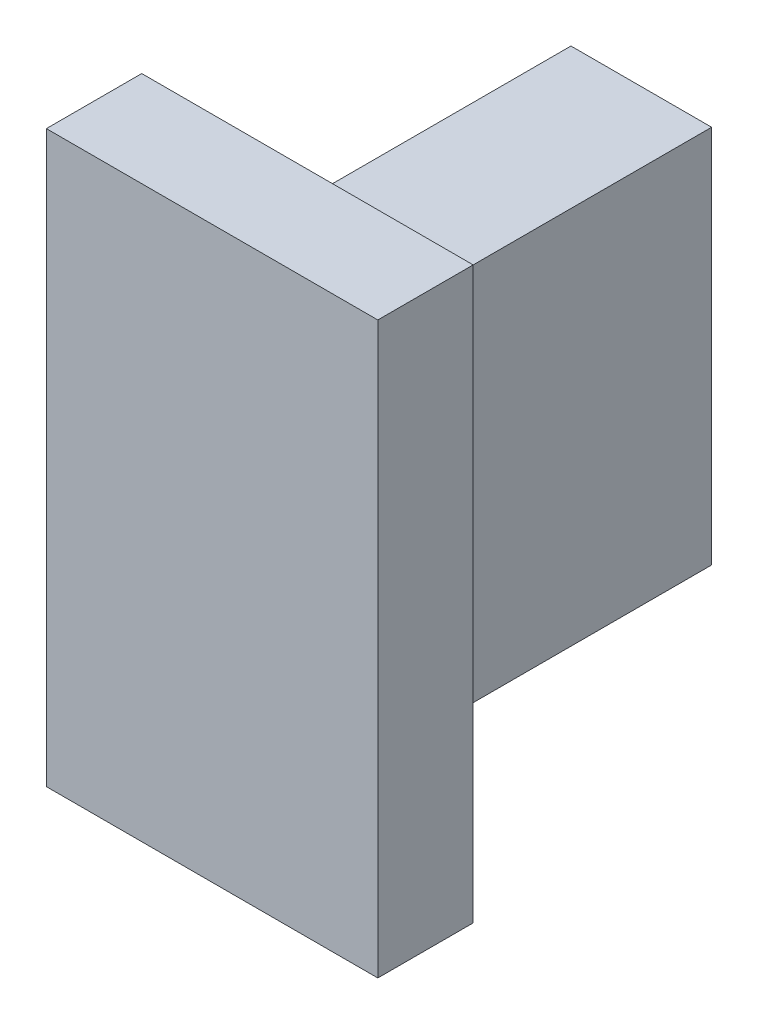
ISO-10303-21;
HEADER;
FILE_DESCRIPTION(('STEP AP214'),'2;1');
FILE_NAME('part.step','',(''),(''),'','','');
FILE_SCHEMA(('AUTOMOTIVE_DESIGN { 1 0 10303 214 1 1 1 1 }'));
ENDSEC;
DATA;
#1=APPLICATION_CONTEXT('core data for automotive mechanical design processes');
#2=APPLICATION_PROTOCOL_DEFINITION('international standard','automotive_design',2000,#1);
#3=PRODUCT_CONTEXT('',#1,'mechanical');
#4=PRODUCT('Part','Part','',(#3));
#5=PRODUCT_RELATED_PRODUCT_CATEGORY('part','',(#4));
#6=PRODUCT_DEFINITION_FORMATION('','',#4);
#7=PRODUCT_DEFINITION_CONTEXT('part definition',#1,'design');
#8=PRODUCT_DEFINITION('design','',#6,#7);
#9=PRODUCT_DEFINITION_SHAPE('','',#8);
#10=(LENGTH_UNIT() NAMED_UNIT(*) SI_UNIT(.MILLI.,.METRE.));
#11=(NAMED_UNIT(*) PLANE_ANGLE_UNIT() SI_UNIT($,.RADIAN.));
#12=(NAMED_UNIT(*) SI_UNIT($,.STERADIAN.) SOLID_ANGLE_UNIT());
#13=UNCERTAINTY_MEASURE_WITH_UNIT(LENGTH_MEASURE(1.E-05),#10,'distance_accuracy_value','');
#14=(GEOMETRIC_REPRESENTATION_CONTEXT(3) GLOBAL_UNCERTAINTY_ASSIGNED_CONTEXT((#13)) GLOBAL_UNIT_ASSIGNED_CONTEXT((#10,
#11,#12)) REPRESENTATION_CONTEXT('',''));
#15=CARTESIAN_POINT('',(0.,0.,0.));
#16=DIRECTION('',(0.,0.,1.));
#17=DIRECTION('',(1.,0.,0.));
#18=AXIS2_PLACEMENT_3D('',#15,#16,#17);
#19=CARTESIAN_POINT('',(-0.531620553359684,1.23320158102767,8.));
#20=DIRECTION('',(1.,0.,0.));
#21=DIRECTION('',(0.,1.,0.));
#22=AXIS2_PLACEMENT_3D('',#19,#20,#21);
#23=PLANE('',#22);
#24=DIRECTION('',(0.,-1.,0.));
#25=VECTOR('',#24,1.);
#26=CARTESIAN_POINT('',(-0.531620553359684,1.23320158102767,7.5));
#27=LINE('',#26,#25);
#28=CARTESIAN_POINT('',(-0.531620553359684,-2.74429841897233,7.5));
#29=VERTEX_POINT('',#28);
#30=CARTESIAN_POINT('',(-0.531620553359684,-4.18429841897233,7.5));
#31=VERTEX_POINT('',#30);
#32=EDGE_CURVE('E568',#29,#31,#27,.T.);
#33=ORIENTED_EDGE('',*,*,#32,.T.);
#34=DIRECTION('',(0.,0.,1.));
#35=VECTOR('',#34,1.);
#36=CARTESIAN_POINT('',(-0.531620553359684,-4.18429841897233,-1.97294196569489));
#37=LINE('',#36,#35);
#38=CARTESIAN_POINT('',(-0.531620553359684,-4.18429841897233,0.));
#39=VERTEX_POINT('',#38);
#40=EDGE_CURVE('E326',#39,#31,#37,.T.);
#41=ORIENTED_EDGE('',*,*,#40,.F.);
#42=DIRECTION('',(0.,-1.,0.));
#43=VECTOR('',#42,1.);
#44=CARTESIAN_POINT('',(-0.531620553359684,1.23320158102767,0.));
#45=LINE('',#44,#43);
#46=CARTESIAN_POINT('',(-0.531620553359684,-2.74429841897233,0.));
#47=VERTEX_POINT('',#46);
#48=EDGE_CURVE('E587',#47,#39,#45,.T.);
#49=ORIENTED_EDGE('',*,*,#48,.F.);
#50=DIRECTION('',(0.,0.,1.));
#51=VECTOR('',#50,1.);
#52=CARTESIAN_POINT('',(-0.531620553359684,-2.74429841897233,-1.97294196569489));
#53=LINE('',#52,#51);
#54=EDGE_CURVE('E354',#47,#29,#53,.T.);
#55=ORIENTED_EDGE('',*,*,#54,.T.);
#56=EDGE_LOOP('',(#33,#41,#49,#55));
#57=FACE_BOUND('',#56,.T.);
#58=ADVANCED_FACE('F39',(#57),#23,.T.);
#59=CARTESIAN_POINT('',(-0.531620553359684,-4.48429841897233,0.));
#60=VERTEX_POINT('',#59);
#61=CARTESIAN_POINT('',(-0.531620553359683,-6.21679841897233,0.));
#62=VERTEX_POINT('',#61);
#63=EDGE_CURVE('E407',#60,#62,#45,.T.);
#64=ORIENTED_EDGE('',*,*,#63,.F.);
#65=DIRECTION('',(0.,0.,1.));
#66=VECTOR('',#65,1.);
#67=CARTESIAN_POINT('',(-0.531620553359684,-4.48429841897233,-1.97294196569489));
#68=LINE('',#67,#66);
#69=CARTESIAN_POINT('',(-0.531620553359684,-4.48429841897233,7.5));
#70=VERTEX_POINT('',#69);
#71=EDGE_CURVE('E329',#60,#70,#68,.T.);
#72=ORIENTED_EDGE('',*,*,#71,.T.);
#73=CARTESIAN_POINT('',(-0.531620553359683,-6.21679841897233,7.5));
#74=VERTEX_POINT('',#73);
#75=EDGE_CURVE('E420',#70,#74,#27,.T.);
#76=ORIENTED_EDGE('',*,*,#75,.T.);
#77=DIRECTION('',(0.,0.,-1.));
#78=VECTOR('',#77,1.);
#79=CARTESIAN_POINT('',(-0.531620553359683,-6.21679841897233,8.));
#80=LINE('',#79,#78);
#81=EDGE_CURVE('E408',#74,#62,#80,.T.);
#82=ORIENTED_EDGE('',*,*,#81,.T.);
#83=EDGE_LOOP('',(#64,#72,#76,#82));
#84=FACE_BOUND('',#83,.T.);
#85=ADVANCED_FACE('F524',(#84),#23,.T.);
#86=CARTESIAN_POINT('',(1.41837944664032,1.23320158102767,8.));
#87=DIRECTION('',(-1.,0.,0.));
#88=DIRECTION('',(0.,-1.,0.));
#89=AXIS2_PLACEMENT_3D('',#86,#87,#88);
#90=PLANE('',#89);
#91=DIRECTION('',(0.,1.,0.));
#92=VECTOR('',#91,1.);
#93=CARTESIAN_POINT('',(1.41837944664032,1.23320158102767,0.));
#94=LINE('',#93,#92);
#95=CARTESIAN_POINT('',(1.41837944664032,-4.18429841897233,0.));
#96=VERTEX_POINT('',#95);
#97=CARTESIAN_POINT('',(1.41837944664032,-2.74429841897233,0.));
#98=VERTEX_POINT('',#97);
#99=EDGE_CURVE('E456',#96,#98,#94,.T.);
#100=ORIENTED_EDGE('',*,*,#99,.F.);
#101=DIRECTION('',(0.,0.,1.));
#102=VECTOR('',#101,1.);
#103=CARTESIAN_POINT('',(1.41837944664032,-4.18429841897233,-1.97294196569489));
#104=LINE('',#103,#102);
#105=CARTESIAN_POINT('',(1.41837944664032,-4.18429841897233,7.5));
#106=VERTEX_POINT('',#105);
#107=EDGE_CURVE('E55',#96,#106,#104,.T.);
#108=ORIENTED_EDGE('',*,*,#107,.T.);
#109=DIRECTION('',(0.,1.,0.));
#110=VECTOR('',#109,1.);
#111=CARTESIAN_POINT('',(1.41837944664032,1.23320158102767,7.5));
#112=LINE('',#111,#110);
#113=CARTESIAN_POINT('',(1.41837944664032,-2.74429841897233,7.5));
#114=VERTEX_POINT('',#113);
#115=EDGE_CURVE('E439',#106,#114,#112,.T.);
#116=ORIENTED_EDGE('',*,*,#115,.T.);
#117=DIRECTION('',(0.,0.,1.));
#118=VECTOR('',#117,1.);
#119=CARTESIAN_POINT('',(1.41837944664032,-2.74429841897233,-1.97294196569489));
#120=LINE('',#119,#118);
#121=EDGE_CURVE('E358',#98,#114,#120,.T.);
#122=ORIENTED_EDGE('',*,*,#121,.F.);
#123=EDGE_LOOP('',(#100,#108,#116,#122));
#124=FACE_BOUND('',#123,.T.);
#125=ADVANCED_FACE('F531',(#124),#90,.T.);
#126=CARTESIAN_POINT('',(1.41837944664032,-6.21679841897233,7.5));
#127=VERTEX_POINT('',#126);
#128=CARTESIAN_POINT('',(1.41837944664032,-4.48429841897233,7.5));
#129=VERTEX_POINT('',#128);
#130=EDGE_CURVE('E435',#127,#129,#112,.T.);
#131=ORIENTED_EDGE('',*,*,#130,.T.);
#132=DIRECTION('',(0.,0.,1.));
#133=VECTOR('',#132,1.);
#134=CARTESIAN_POINT('',(1.41837944664032,-4.48429841897233,-1.97294196569489));
#135=LINE('',#134,#133);
#136=CARTESIAN_POINT('',(1.41837944664032,-4.48429841897233,0.));
#137=VERTEX_POINT('',#136);
#138=EDGE_CURVE('E333',#137,#129,#135,.T.);
#139=ORIENTED_EDGE('',*,*,#138,.F.);
#140=CARTESIAN_POINT('',(1.41837944664032,-6.21679841897233,0.));
#141=VERTEX_POINT('',#140);
#142=EDGE_CURVE('E452',#141,#137,#94,.T.);
#143=ORIENTED_EDGE('',*,*,#142,.F.);
#144=DIRECTION('',(0.,0.,-1.));
#145=VECTOR('',#144,1.);
#146=CARTESIAN_POINT('',(1.41837944664032,-6.21679841897233,8.));
#147=LINE('',#146,#145);
#148=EDGE_CURVE('E413',#127,#141,#147,.T.);
#149=ORIENTED_EDGE('',*,*,#148,.F.);
#150=EDGE_LOOP('',(#131,#139,#143,#149));
#151=FACE_BOUND('',#150,.T.);
#152=ADVANCED_FACE('F558',(#151),#90,.T.);
#153=CARTESIAN_POINT('',(0.,0.,7.5));
#154=DIRECTION('',(0.,0.,1.));
#155=DIRECTION('',(1.,0.,0.));
#156=AXIS2_PLACEMENT_3D('',#153,#154,#155);
#157=PLANE('',#156);
#158=DIRECTION('',(1.,0.,0.));
#159=VECTOR('',#158,1.);
#160=CARTESIAN_POINT('',(1.41837944664032,-4.18429841897233,7.5));
#161=LINE('',#160,#159);
#162=EDGE_CURVE('E321',#31,#106,#161,.T.);
#163=ORIENTED_EDGE('',*,*,#162,.F.);
#164=ORIENTED_EDGE('',*,*,#32,.F.);
#165=DIRECTION('',(-1.,0.,0.));
#166=VECTOR('',#165,1.);
#167=CARTESIAN_POINT('',(1.41837944664032,-2.74429841897233,7.5));
#168=LINE('',#167,#166);
#169=EDGE_CURVE('E317',#114,#29,#168,.T.);
#170=ORIENTED_EDGE('',*,*,#169,.F.);
#171=ORIENTED_EDGE('',*,*,#115,.F.);
#172=EDGE_LOOP('',(#163,#164,#170,#171));
#173=FACE_BOUND('',#172,.T.);
#174=ADVANCED_FACE('F559',(#173),#157,.F.);
#175=DIRECTION('',(-1.,0.,0.));
#176=VECTOR('',#175,1.);
#177=CARTESIAN_POINT('',(1.41837944664032,-4.48429841897233,7.5));
#178=LINE('',#177,#176);
#179=EDGE_CURVE('E305',#129,#70,#178,.T.);
#180=ORIENTED_EDGE('',*,*,#179,.F.);
#181=ORIENTED_EDGE('',*,*,#130,.F.);
#182=DIRECTION('',(1.,0.,0.));
#183=VECTOR('',#182,1.);
#184=CARTESIAN_POINT('',(-1.03162055335968,-6.21679841897233,7.5));
#185=LINE('',#184,#183);
#186=EDGE_CURVE('E418',#74,#127,#185,.T.);
#187=ORIENTED_EDGE('',*,*,#186,.F.);
#188=ORIENTED_EDGE('',*,*,#75,.F.);
#189=EDGE_LOOP('',(#180,#181,#187,#188));
#190=FACE_BOUND('',#189,.T.);
#191=ADVANCED_FACE('F550',(#190),#157,.F.);
#192=CARTESIAN_POINT('',(-0.531620553359684,-1.00429841897233,7.5));
#193=VERTEX_POINT('',#192);
#194=CARTESIAN_POINT('',(-0.531620553359684,-2.44429841897233,7.5));
#195=VERTEX_POINT('',#194);
#196=EDGE_CURVE('E419',#193,#195,#27,.T.);
#197=ORIENTED_EDGE('',*,*,#196,.T.);
#198=DIRECTION('',(0.,0.,1.));
#199=VECTOR('',#198,1.);
#200=CARTESIAN_POINT('',(-0.531620553359684,-2.44429841897233,-1.97294196569489));
#201=LINE('',#200,#199);
#202=CARTESIAN_POINT('',(-0.531620553359684,-2.44429841897233,0.));
#203=VERTEX_POINT('',#202);
#204=EDGE_CURVE('E351',#203,#195,#201,.T.);
#205=ORIENTED_EDGE('',*,*,#204,.F.);
#206=CARTESIAN_POINT('',(-0.531620553359684,-1.00429841897233,0.));
#207=VERTEX_POINT('',#206);
#208=EDGE_CURVE('E447',#207,#203,#45,.T.);
#209=ORIENTED_EDGE('',*,*,#208,.F.);
#210=DIRECTION('',(0.,0.,1.));
#211=VECTOR('',#210,1.);
#212=CARTESIAN_POINT('',(-0.531620553359684,-1.00429841897233,-1.97294196569489));
#213=LINE('',#212,#211);
#214=EDGE_CURVE('E383',#207,#193,#213,.T.);
#215=ORIENTED_EDGE('',*,*,#214,.T.);
#216=EDGE_LOOP('',(#197,#205,#209,#215));
#217=FACE_BOUND('',#216,.T.);
#218=ADVANCED_FACE('F533',(#217),#23,.T.);
#219=CARTESIAN_POINT('',(1.41837944664032,-2.44429841897233,0.));
#220=VERTEX_POINT('',#219);
#221=CARTESIAN_POINT('',(1.41837944664032,-1.00429841897233,0.));
#222=VERTEX_POINT('',#221);
#223=EDGE_CURVE('E596',#220,#222,#94,.T.);
#224=ORIENTED_EDGE('',*,*,#223,.F.);
#225=DIRECTION('',(0.,0.,1.));
#226=VECTOR('',#225,1.);
#227=CARTESIAN_POINT('',(1.41837944664032,-2.44429841897233,-1.97294196569489));
#228=LINE('',#227,#226);
#229=CARTESIAN_POINT('',(1.41837944664032,-2.44429841897233,7.5));
#230=VERTEX_POINT('',#229);
#231=EDGE_CURVE('E63',#220,#230,#228,.T.);
#232=ORIENTED_EDGE('',*,*,#231,.T.);
#233=CARTESIAN_POINT('',(1.41837944664032,-1.00429841897233,7.5));
#234=VERTEX_POINT('',#233);
#235=EDGE_CURVE('E601',#230,#234,#112,.T.);
#236=ORIENTED_EDGE('',*,*,#235,.T.);
#237=DIRECTION('',(0.,0.,1.));
#238=VECTOR('',#237,1.);
#239=CARTESIAN_POINT('',(1.41837944664032,-1.00429841897233,-1.97294196569489));
#240=LINE('',#239,#238);
#241=EDGE_CURVE('E387',#222,#234,#240,.T.);
#242=ORIENTED_EDGE('',*,*,#241,.F.);
#243=EDGE_LOOP('',(#224,#232,#236,#242));
#244=FACE_BOUND('',#243,.T.);
#245=ADVANCED_FACE('F547',(#244),#90,.T.);
#246=DIRECTION('',(1.,0.,0.));
#247=VECTOR('',#246,1.);
#248=CARTESIAN_POINT('',(1.41837944664032,-2.44429841897233,7.5));
#249=LINE('',#248,#247);
#250=EDGE_CURVE('E346',#195,#230,#249,.T.);
#251=ORIENTED_EDGE('',*,*,#250,.F.);
#252=ORIENTED_EDGE('',*,*,#196,.F.);
#253=DIRECTION('',(-1.,0.,0.));
#254=VECTOR('',#253,1.);
#255=CARTESIAN_POINT('',(1.41837944664032,-1.00429841897233,7.5));
#256=LINE('',#255,#254);
#257=EDGE_CURVE('E342',#234,#193,#256,.T.);
#258=ORIENTED_EDGE('',*,*,#257,.F.);
#259=ORIENTED_EDGE('',*,*,#235,.F.);
#260=EDGE_LOOP('',(#251,#252,#258,#259));
#261=FACE_BOUND('',#260,.T.);
#262=ADVANCED_FACE('F539',(#261),#157,.F.);
#263=CARTESIAN_POINT('',(-0.531620553359684,0.733201581027668,7.5));
#264=VERTEX_POINT('',#263);
#265=CARTESIAN_POINT('',(-0.531620553359684,-0.704298418972332,7.5));
#266=VERTEX_POINT('',#265);
#267=EDGE_CURVE('E414',#264,#266,#27,.T.);
#268=ORIENTED_EDGE('',*,*,#267,.T.);
#269=DIRECTION('',(0.,0.,1.));
#270=VECTOR('',#269,1.);
#271=CARTESIAN_POINT('',(-0.531620553359684,-0.704298418972332,-1.97294196569489));
#272=LINE('',#271,#270);
#273=CARTESIAN_POINT('',(-0.531620553359684,-0.704298418972331,0.));
#274=VERTEX_POINT('',#273);
#275=EDGE_CURVE('E379',#274,#266,#272,.T.);
#276=ORIENTED_EDGE('',*,*,#275,.F.);
#277=CARTESIAN_POINT('',(-0.531620553359684,0.733201581027668,0.));
#278=VERTEX_POINT('',#277);
#279=EDGE_CURVE('E442',#278,#274,#45,.T.);
#280=ORIENTED_EDGE('',*,*,#279,.F.);
#281=DIRECTION('',(0.,0.,-1.));
#282=VECTOR('',#281,1.);
#283=CARTESIAN_POINT('',(-0.531620553359684,0.733201581027668,8.));
#284=LINE('',#283,#282);
#285=EDGE_CURVE('E421',#264,#278,#284,.T.);
#286=ORIENTED_EDGE('',*,*,#285,.F.);
#287=EDGE_LOOP('',(#268,#276,#280,#286));
#288=FACE_BOUND('',#287,.T.);
#289=ADVANCED_FACE('F527',(#288),#23,.T.);
#290=CARTESIAN_POINT('',(1.41837944664032,-0.704298418972331,0.));
#291=VERTEX_POINT('',#290);
#292=CARTESIAN_POINT('',(1.41837944664032,0.733201581027668,0.));
#293=VERTEX_POINT('',#292);
#294=EDGE_CURVE('E457',#291,#293,#94,.T.);
#295=ORIENTED_EDGE('',*,*,#294,.F.);
#296=DIRECTION('',(0.,0.,1.));
#297=VECTOR('',#296,1.);
#298=CARTESIAN_POINT('',(1.41837944664032,-0.704298418972332,-1.97294196569489));
#299=LINE('',#298,#297);
#300=CARTESIAN_POINT('',(1.41837944664032,-0.704298418972332,7.5));
#301=VERTEX_POINT('',#300);
#302=EDGE_CURVE('E376',#291,#301,#299,.T.);
#303=ORIENTED_EDGE('',*,*,#302,.T.);
#304=CARTESIAN_POINT('',(1.41837944664032,0.733201581027668,7.5));
#305=VERTEX_POINT('',#304);
#306=EDGE_CURVE('E431',#301,#305,#112,.T.);
#307=ORIENTED_EDGE('',*,*,#306,.T.);
#308=DIRECTION('',(0.,0.,-1.));
#309=VECTOR('',#308,1.);
#310=CARTESIAN_POINT('',(1.41837944664032,0.733201581027668,8.));
#311=LINE('',#310,#309);
#312=EDGE_CURVE('E424',#305,#293,#311,.T.);
#313=ORIENTED_EDGE('',*,*,#312,.T.);
#314=EDGE_LOOP('',(#295,#303,#307,#313));
#315=FACE_BOUND('',#314,.T.);
#316=ADVANCED_FACE('F538',(#315),#90,.T.);
#317=DIRECTION('',(1.,0.,0.));
#318=VECTOR('',#317,1.);
#319=CARTESIAN_POINT('',(1.41837944664032,-0.704298418972332,7.5));
#320=LINE('',#319,#318);
#321=EDGE_CURVE('E372',#266,#301,#320,.T.);
#322=ORIENTED_EDGE('',*,*,#321,.F.);
#323=ORIENTED_EDGE('',*,*,#267,.F.);
#324=DIRECTION('',(-1.,0.,0.));
#325=VECTOR('',#324,1.);
#326=CARTESIAN_POINT('',(-1.03162055335968,0.733201581027668,7.5));
#327=LINE('',#326,#325);
#328=EDGE_CURVE('E425',#305,#264,#327,.T.);
#329=ORIENTED_EDGE('',*,*,#328,.F.);
#330=ORIENTED_EDGE('',*,*,#306,.F.);
#331=EDGE_LOOP('',(#322,#323,#329,#330));
#332=FACE_BOUND('',#331,.T.);
#333=ADVANCED_FACE('F522',(#332),#157,.F.);
#334=CARTESIAN_POINT('',(-1.03162055335968,1.23320158102767,8.));
#335=DIRECTION('',(1.,0.,0.));
#336=DIRECTION('',(0.,1.,0.));
#337=AXIS2_PLACEMENT_3D('',#334,#335,#336);
#338=PLANE('',#337);
#339=DIRECTION('',(0.,-1.,0.));
#340=VECTOR('',#339,1.);
#341=CARTESIAN_POINT('',(-1.03162055335968,1.23320158102767,0.));
#342=LINE('',#341,#340);
#343=CARTESIAN_POINT('',(-1.03162055335968,1.23320158102767,0.));
#344=VERTEX_POINT('',#343);
#345=CARTESIAN_POINT('',(-1.03162055335968,-6.71679841897233,0.));
#346=VERTEX_POINT('',#345);
#347=EDGE_CURVE('E412',#344,#346,#342,.T.);
#348=ORIENTED_EDGE('',*,*,#347,.T.);
#349=DIRECTION('',(0.,0.,-1.));
#350=VECTOR('',#349,1.);
#351=CARTESIAN_POINT('',(-1.03162055335968,-6.71679841897233,8.));
#352=LINE('',#351,#350);
#353=CARTESIAN_POINT('',(-1.03162055335968,-6.71679841897233,8.));
#354=VERTEX_POINT('',#353);
#355=EDGE_CURVE('E11',#354,#346,#352,.T.);
#356=ORIENTED_EDGE('',*,*,#355,.F.);
#357=DIRECTION('',(0.,-1.,0.));
#358=VECTOR('',#357,1.);
#359=CARTESIAN_POINT('',(-1.03162055335968,1.23320158102767,8.));
#360=LINE('',#359,#358);
#361=CARTESIAN_POINT('',(-1.03162055335968,1.23320158102767,8.));
#362=VERTEX_POINT('',#361);
#363=EDGE_CURVE('E461',#362,#354,#360,.T.);
#364=ORIENTED_EDGE('',*,*,#363,.F.);
#365=DIRECTION('',(0.,0.,-1.));
#366=VECTOR('',#365,1.);
#367=CARTESIAN_POINT('',(-1.03162055335968,1.23320158102767,8.));
#368=LINE('',#367,#366);
#369=EDGE_CURVE('E478',#362,#344,#368,.T.);
#370=ORIENTED_EDGE('',*,*,#369,.T.);
#371=EDGE_LOOP('',(#348,#356,#364,#370));
#372=FACE_BOUND('',#371,.T.);
#373=ADVANCED_FACE('F41',(#372),#338,.F.);
#374=CARTESIAN_POINT('',(-1.03162055335968,-6.71679841897233,8.));
#375=DIRECTION('',(0.,1.,0.));
#376=DIRECTION('',(0.,0.,1.));
#377=AXIS2_PLACEMENT_3D('',#374,#375,#376);
#378=PLANE('',#377);
#379=DIRECTION('',(1.,0.,0.));
#380=VECTOR('',#379,1.);
#381=CARTESIAN_POINT('',(-1.03162055335968,-6.71679841897233,0.));
#382=LINE('',#381,#380);
#383=CARTESIAN_POINT('',(1.91837944664032,-6.71679841897233,0.));
#384=VERTEX_POINT('',#383);
#385=EDGE_CURVE('E482',#346,#384,#382,.T.);
#386=ORIENTED_EDGE('',*,*,#385,.T.);
#387=DIRECTION('',(0.,0.,-1.));
#388=VECTOR('',#387,1.);
#389=CARTESIAN_POINT('',(1.91837944664032,-6.71679841897233,8.));
#390=LINE('',#389,#388);
#391=CARTESIAN_POINT('',(1.91837944664032,-6.71679841897233,8.));
#392=VERTEX_POINT('',#391);
#393=EDGE_CURVE('E48',#392,#384,#390,.T.);
#394=ORIENTED_EDGE('',*,*,#393,.F.);
#395=DIRECTION('',(1.,0.,0.));
#396=VECTOR('',#395,1.);
#397=CARTESIAN_POINT('',(-1.03162055335968,-6.71679841897233,8.));
#398=LINE('',#397,#396);
#399=EDGE_CURVE('E465',#354,#392,#398,.T.);
#400=ORIENTED_EDGE('',*,*,#399,.F.);
#401=ORIENTED_EDGE('',*,*,#355,.T.);
#402=EDGE_LOOP('',(#386,#394,#400,#401));
#403=FACE_BOUND('',#402,.T.);
#404=ADVANCED_FACE('F515',(#403),#378,.F.);
#405=CARTESIAN_POINT('',(1.91837944664032,1.23320158102767,8.));
#406=DIRECTION('',(-1.,0.,0.));
#407=DIRECTION('',(0.,-1.,0.));
#408=AXIS2_PLACEMENT_3D('',#405,#406,#407);
#409=PLANE('',#408);
#410=DIRECTION('',(0.,1.,0.));
#411=VECTOR('',#410,1.);
#412=CARTESIAN_POINT('',(1.91837944664032,1.23320158102767,0.));
#413=LINE('',#412,#411);
#414=CARTESIAN_POINT('',(1.91837944664032,1.23320158102767,0.));
#415=VERTEX_POINT('',#414);
#416=EDGE_CURVE('E485',#384,#415,#413,.T.);
#417=ORIENTED_EDGE('',*,*,#416,.T.);
#418=DIRECTION('',(0.,0.,-1.));
#419=VECTOR('',#418,1.);
#420=CARTESIAN_POINT('',(1.91837944664032,1.23320158102767,8.));
#421=LINE('',#420,#419);
#422=CARTESIAN_POINT('',(1.91837944664032,1.23320158102767,8.));
#423=VERTEX_POINT('',#422);
#424=EDGE_CURVE('E493',#423,#415,#421,.T.);
#425=ORIENTED_EDGE('',*,*,#424,.F.);
#426=DIRECTION('',(0.,1.,0.));
#427=VECTOR('',#426,1.);
#428=CARTESIAN_POINT('',(1.91837944664032,1.23320158102767,8.));
#429=LINE('',#428,#427);
#430=EDGE_CURVE('E470',#392,#423,#429,.T.);
#431=ORIENTED_EDGE('',*,*,#430,.F.);
#432=ORIENTED_EDGE('',*,*,#393,.T.);
#433=EDGE_LOOP('',(#417,#425,#431,#432));
#434=FACE_BOUND('',#433,.T.);
#435=ADVANCED_FACE('F501',(#434),#409,.F.);
#436=CARTESIAN_POINT('',(-1.03162055335968,1.23320158102767,8.));
#437=DIRECTION('',(0.,-1.,0.));
#438=DIRECTION('',(0.,0.,-1.));
#439=AXIS2_PLACEMENT_3D('',#436,#437,#438);
#440=PLANE('',#439);
#441=DIRECTION('',(-1.,0.,0.));
#442=VECTOR('',#441,1.);
#443=CARTESIAN_POINT('',(-1.03162055335968,1.23320158102767,0.));
#444=LINE('',#443,#442);
#445=EDGE_CURVE('E466',#415,#344,#444,.T.);
#446=ORIENTED_EDGE('',*,*,#445,.T.);
#447=ORIENTED_EDGE('',*,*,#369,.F.);
#448=DIRECTION('',(-1.,0.,0.));
#449=VECTOR('',#448,1.);
#450=CARTESIAN_POINT('',(-1.03162055335968,1.23320158102767,8.));
#451=LINE('',#450,#449);
#452=EDGE_CURVE('E474',#423,#362,#451,.T.);
#453=ORIENTED_EDGE('',*,*,#452,.F.);
#454=ORIENTED_EDGE('',*,*,#424,.T.);
#455=EDGE_LOOP('',(#446,#447,#453,#454));
#456=FACE_BOUND('',#455,.T.);
#457=ADVANCED_FACE('F509',(#456),#440,.F.);
#458=CARTESIAN_POINT('',(0.,0.,0.));
#459=DIRECTION('',(0.,0.,1.));
#460=DIRECTION('',(1.,0.,0.));
#461=AXIS2_PLACEMENT_3D('',#458,#459,#460);
#462=PLANE('',#461);
#463=DIRECTION('',(1.,0.,0.));
#464=VECTOR('',#463,1.);
#465=CARTESIAN_POINT('',(1.41837944664032,-4.48429841897233,0.));
#466=LINE('',#465,#464);
#467=EDGE_CURVE('E314',#60,#137,#466,.T.);
#468=ORIENTED_EDGE('',*,*,#467,.F.);
#469=ORIENTED_EDGE('',*,*,#63,.T.);
#470=DIRECTION('',(1.,0.,0.));
#471=VECTOR('',#470,1.);
#472=CARTESIAN_POINT('',(-1.03162055335968,-6.21679841897233,0.));
#473=LINE('',#472,#471);
#474=EDGE_CURVE('E446',#62,#141,#473,.T.);
#475=ORIENTED_EDGE('',*,*,#474,.T.);
#476=ORIENTED_EDGE('',*,*,#142,.T.);
#477=EDGE_LOOP('',(#468,#469,#475,#476));
#478=FACE_BOUND('',#477,.T.);
#479=DIRECTION('',(1.,0.,0.));
#480=VECTOR('',#479,1.);
#481=CARTESIAN_POINT('',(1.41837944664032,-2.74429841897233,0.));
#482=LINE('',#481,#480);
#483=EDGE_CURVE('E338',#47,#98,#482,.T.);
#484=ORIENTED_EDGE('',*,*,#483,.F.);
#485=ORIENTED_EDGE('',*,*,#48,.T.);
#486=DIRECTION('',(-1.,0.,0.));
#487=VECTOR('',#486,1.);
#488=CARTESIAN_POINT('',(1.41837944664032,-4.18429841897233,0.));
#489=LINE('',#488,#487);
#490=EDGE_CURVE('E318',#96,#39,#489,.T.);
#491=ORIENTED_EDGE('',*,*,#490,.F.);
#492=ORIENTED_EDGE('',*,*,#99,.T.);
#493=EDGE_LOOP('',(#484,#485,#491,#492));
#494=FACE_BOUND('',#493,.T.);
#495=DIRECTION('',(1.,0.,0.));
#496=VECTOR('',#495,1.);
#497=CARTESIAN_POINT('',(1.41837944664032,-1.00429841897233,0.));
#498=LINE('',#497,#496);
#499=EDGE_CURVE('E364',#207,#222,#498,.T.);
#500=ORIENTED_EDGE('',*,*,#499,.F.);
#501=ORIENTED_EDGE('',*,*,#208,.T.);
#502=DIRECTION('',(-1.,0.,0.));
#503=VECTOR('',#502,1.);
#504=CARTESIAN_POINT('',(1.41837944664032,-2.44429841897233,0.));
#505=LINE('',#504,#503);
#506=EDGE_CURVE('E343',#220,#203,#505,.T.);
#507=ORIENTED_EDGE('',*,*,#506,.F.);
#508=ORIENTED_EDGE('',*,*,#223,.T.);
#509=EDGE_LOOP('',(#500,#501,#507,#508));
#510=FACE_BOUND('',#509,.T.);
#511=DIRECTION('',(-1.,0.,0.));
#512=VECTOR('',#511,1.);
#513=CARTESIAN_POINT('',(-1.03162055335968,0.733201581027668,0.));
#514=LINE('',#513,#512);
#515=EDGE_CURVE('E448',#293,#278,#514,.T.);
#516=ORIENTED_EDGE('',*,*,#515,.T.);
#517=ORIENTED_EDGE('',*,*,#279,.T.);
#518=DIRECTION('',(-1.,0.,0.));
#519=VECTOR('',#518,1.);
#520=CARTESIAN_POINT('',(1.41837944664032,-0.704298418972332,0.));
#521=LINE('',#520,#519);
#522=EDGE_CURVE('E368',#291,#274,#521,.T.);
#523=ORIENTED_EDGE('',*,*,#522,.F.);
#524=ORIENTED_EDGE('',*,*,#294,.T.);
#525=EDGE_LOOP('',(#516,#517,#523,#524));
#526=FACE_BOUND('',#525,.T.);
#527=ORIENTED_EDGE('',*,*,#347,.F.);
#528=ORIENTED_EDGE('',*,*,#445,.F.);
#529=ORIENTED_EDGE('',*,*,#416,.F.);
#530=ORIENTED_EDGE('',*,*,#385,.F.);
#531=EDGE_LOOP('',(#527,#528,#529,#530));
#532=FACE_BOUND('',#531,.T.);
#533=ADVANCED_FACE('F506',(#478,#494,#510,#526,#532),#462,.F.);
#534=CARTESIAN_POINT('',(-1.03162055335968,-6.21679841897233,8.));
#535=DIRECTION('',(0.,1.,0.));
#536=DIRECTION('',(0.,0.,1.));
#537=AXIS2_PLACEMENT_3D('',#534,#535,#536);
#538=PLANE('',#537);
#539=ORIENTED_EDGE('',*,*,#474,.F.);
#540=ORIENTED_EDGE('',*,*,#81,.F.);
#541=ORIENTED_EDGE('',*,*,#186,.T.);
#542=ORIENTED_EDGE('',*,*,#148,.T.);
#543=EDGE_LOOP('',(#539,#540,#541,#542));
#544=FACE_BOUND('',#543,.T.);
#545=ADVANCED_FACE('F583',(#544),#538,.T.);
#546=CARTESIAN_POINT('',(-1.03162055335968,0.733201581027668,8.));
#547=DIRECTION('',(0.,-1.,0.));
#548=DIRECTION('',(0.,0.,-1.));
#549=AXIS2_PLACEMENT_3D('',#546,#547,#548);
#550=PLANE('',#549);
#551=ORIENTED_EDGE('',*,*,#515,.F.);
#552=ORIENTED_EDGE('',*,*,#312,.F.);
#553=ORIENTED_EDGE('',*,*,#328,.T.);
#554=ORIENTED_EDGE('',*,*,#285,.T.);
#555=EDGE_LOOP('',(#551,#552,#553,#554));
#556=FACE_BOUND('',#555,.T.);
#557=ADVANCED_FACE('F612',(#556),#550,.T.);
#558=CARTESIAN_POINT('',(0.,0.,8.));
#559=DIRECTION('',(0.,0.,1.));
#560=DIRECTION('',(1.,0.,0.));
#561=AXIS2_PLACEMENT_3D('',#558,#559,#560);
#562=PLANE('',#561);
#563=DIRECTION('',(0.,-1.,0.));
#564=VECTOR('',#563,1.);
#565=CARTESIAN_POINT('',(-2.03162055335968,2.23320158102767,8.));
#566=LINE('',#565,#564);
#567=CARTESIAN_POINT('',(-2.03162055335968,2.23320158102767,8.));
#568=VERTEX_POINT('',#567);
#569=CARTESIAN_POINT('',(-2.03162055335968,-7.71679841897233,8.));
#570=VERTEX_POINT('',#569);
#571=EDGE_CURVE('E233',#568,#570,#566,.T.);
#572=ORIENTED_EDGE('',*,*,#571,.F.);
#573=DIRECTION('',(-1.,0.,0.));
#574=VECTOR('',#573,1.);
#575=CARTESIAN_POINT('',(-2.03162055335968,2.23320158102767,8.));
#576=LINE('',#575,#574);
#577=CARTESIAN_POINT('',(2.91837944664032,2.23320158102767,8.));
#578=VERTEX_POINT('',#577);
#579=EDGE_CURVE('E403',#578,#568,#576,.T.);
#580=ORIENTED_EDGE('',*,*,#579,.F.);
#581=DIRECTION('',(0.,1.,0.));
#582=VECTOR('',#581,1.);
#583=CARTESIAN_POINT('',(2.91837944664032,2.23320158102767,8.));
#584=LINE('',#583,#582);
#585=CARTESIAN_POINT('',(2.91837944664032,-7.71679841897233,8.));
#586=VERTEX_POINT('',#585);
#587=EDGE_CURVE('E399',#586,#578,#584,.T.);
#588=ORIENTED_EDGE('',*,*,#587,.F.);
#589=DIRECTION('',(1.,0.,0.));
#590=VECTOR('',#589,1.);
#591=CARTESIAN_POINT('',(-2.03162055335968,-7.71679841897233,8.));
#592=LINE('',#591,#590);
#593=EDGE_CURVE('E396',#570,#586,#592,.T.);
#594=ORIENTED_EDGE('',*,*,#593,.F.);
#595=EDGE_LOOP('',(#572,#580,#588,#594));
#596=FACE_BOUND('',#595,.T.);
#597=ORIENTED_EDGE('',*,*,#452,.T.);
#598=ORIENTED_EDGE('',*,*,#363,.T.);
#599=ORIENTED_EDGE('',*,*,#399,.T.);
#600=ORIENTED_EDGE('',*,*,#430,.T.);
#601=EDGE_LOOP('',(#597,#598,#599,#600));
#602=FACE_BOUND('',#601,.T.);
#603=ADVANCED_FACE('F514',(#596,#602),#562,.F.);
#604=CARTESIAN_POINT('',(1.41837944664032,-0.704298418972332,-1.97294196569489));
#605=DIRECTION('',(0.,-1.,0.));
#606=DIRECTION('',(1.,0.,0.));
#607=AXIS2_PLACEMENT_3D('',#604,#605,#606);
#608=PLANE('',#607);
#609=ORIENTED_EDGE('',*,*,#302,.F.);
#610=ORIENTED_EDGE('',*,*,#522,.T.);
#611=ORIENTED_EDGE('',*,*,#275,.T.);
#612=ORIENTED_EDGE('',*,*,#321,.T.);
#613=EDGE_LOOP('',(#609,#610,#611,#612));
#614=FACE_BOUND('',#613,.T.);
#615=ADVANCED_FACE('F617',(#614),#608,.F.);
#616=CARTESIAN_POINT('',(1.41837944664032,-1.00429841897233,-1.97294196569489));
#617=DIRECTION('',(0.,1.,0.));
#618=DIRECTION('',(-1.,0.,0.));
#619=AXIS2_PLACEMENT_3D('',#616,#617,#618);
#620=PLANE('',#619);
#621=ORIENTED_EDGE('',*,*,#214,.F.);
#622=ORIENTED_EDGE('',*,*,#499,.T.);
#623=ORIENTED_EDGE('',*,*,#241,.T.);
#624=ORIENTED_EDGE('',*,*,#257,.T.);
#625=EDGE_LOOP('',(#621,#622,#623,#624));
#626=FACE_BOUND('',#625,.T.);
#627=ADVANCED_FACE('F599',(#626),#620,.F.);
#628=CARTESIAN_POINT('',(1.41837944664032,-2.44429841897233,-1.97294196569489));
#629=DIRECTION('',(0.,-1.,0.));
#630=DIRECTION('',(0.,0.,-1.));
#631=AXIS2_PLACEMENT_3D('',#628,#629,#630);
#632=PLANE('',#631);
#633=ORIENTED_EDGE('',*,*,#231,.F.);
#634=ORIENTED_EDGE('',*,*,#506,.T.);
#635=ORIENTED_EDGE('',*,*,#204,.T.);
#636=ORIENTED_EDGE('',*,*,#250,.T.);
#637=EDGE_LOOP('',(#633,#634,#635,#636));
#638=FACE_BOUND('',#637,.T.);
#639=ADVANCED_FACE('F642',(#638),#632,.F.);
#640=CARTESIAN_POINT('',(1.41837944664032,-2.74429841897233,-1.97294196569489));
#641=DIRECTION('',(0.,1.,0.));
#642=DIRECTION('',(0.,0.,1.));
#643=AXIS2_PLACEMENT_3D('',#640,#641,#642);
#644=PLANE('',#643);
#645=ORIENTED_EDGE('',*,*,#54,.F.);
#646=ORIENTED_EDGE('',*,*,#483,.T.);
#647=ORIENTED_EDGE('',*,*,#121,.T.);
#648=ORIENTED_EDGE('',*,*,#169,.T.);
#649=EDGE_LOOP('',(#645,#646,#647,#648));
#650=FACE_BOUND('',#649,.T.);
#651=ADVANCED_FACE('F627',(#650),#644,.F.);
#652=CARTESIAN_POINT('',(1.41837944664032,-4.18429841897233,-1.97294196569489));
#653=DIRECTION('',(0.,-1.,0.));
#654=DIRECTION('',(0.,0.,-1.));
#655=AXIS2_PLACEMENT_3D('',#652,#653,#654);
#656=PLANE('',#655);
#657=ORIENTED_EDGE('',*,*,#107,.F.);
#658=ORIENTED_EDGE('',*,*,#490,.T.);
#659=ORIENTED_EDGE('',*,*,#40,.T.);
#660=ORIENTED_EDGE('',*,*,#162,.T.);
#661=EDGE_LOOP('',(#657,#658,#659,#660));
#662=FACE_BOUND('',#661,.T.);
#663=ADVANCED_FACE('F632',(#662),#656,.F.);
#664=CARTESIAN_POINT('',(1.41837944664032,-4.48429841897233,-1.97294196569489));
#665=DIRECTION('',(0.,1.,0.));
#666=DIRECTION('',(0.,0.,1.));
#667=AXIS2_PLACEMENT_3D('',#664,#665,#666);
#668=PLANE('',#667);
#669=ORIENTED_EDGE('',*,*,#71,.F.);
#670=ORIENTED_EDGE('',*,*,#467,.T.);
#671=ORIENTED_EDGE('',*,*,#138,.T.);
#672=ORIENTED_EDGE('',*,*,#179,.T.);
#673=EDGE_LOOP('',(#669,#670,#671,#672));
#674=FACE_BOUND('',#673,.T.);
#675=ADVANCED_FACE('F634',(#674),#668,.F.);
#676=CARTESIAN_POINT('',(-2.03162055335968,2.23320158102767,7.));
#677=DIRECTION('',(-1.,0.,0.));
#678=DIRECTION('',(0.,0.,1.));
#679=AXIS2_PLACEMENT_3D('',#676,#677,#678);
#680=PLANE('',#679);
#681=DIRECTION('',(0.,0.,1.));
#682=VECTOR('',#681,1.);
#683=CARTESIAN_POINT('',(-2.03162055335968,2.23320158102767,7.));
#684=LINE('',#683,#682);
#685=CARTESIAN_POINT('',(-2.03162055335968,2.23320158102767,7.));
#686=VERTEX_POINT('',#685);
#687=EDGE_CURVE('E260',#686,#568,#684,.T.);
#688=ORIENTED_EDGE('',*,*,#687,.T.);
#689=ORIENTED_EDGE('',*,*,#571,.T.);
#690=DIRECTION('',(0.,0.,1.));
#691=VECTOR('',#690,1.);
#692=CARTESIAN_POINT('',(-2.03162055335968,-7.71679841897233,7.));
#693=LINE('',#692,#691);
#694=CARTESIAN_POINT('',(-2.03162055335968,-7.71679841897233,7.));
#695=VERTEX_POINT('',#694);
#696=EDGE_CURVE('E226',#695,#570,#693,.T.);
#697=ORIENTED_EDGE('',*,*,#696,.F.);
#698=DIRECTION('',(0.,-1.,0.));
#699=VECTOR('',#698,1.);
#700=CARTESIAN_POINT('',(-2.03162055335968,2.23320158102767,7.));
#701=LINE('',#700,#699);
#702=EDGE_CURVE('E231',#686,#695,#701,.T.);
#703=ORIENTED_EDGE('',*,*,#702,.F.);
#704=EDGE_LOOP('',(#688,#689,#697,#703));
#705=FACE_BOUND('',#704,.T.);
#706=ADVANCED_FACE('F229',(#705),#680,.F.);
#707=CARTESIAN_POINT('',(-2.03162055335968,2.23320158102767,7.));
#708=DIRECTION('',(0.,1.,0.));
#709=DIRECTION('',(0.,0.,1.));
#710=AXIS2_PLACEMENT_3D('',#707,#708,#709);
#711=PLANE('',#710);
#712=DIRECTION('',(0.,0.,1.));
#713=VECTOR('',#712,1.);
#714=CARTESIAN_POINT('',(2.91837944664032,2.23320158102767,7.));
#715=LINE('',#714,#713);
#716=CARTESIAN_POINT('',(2.91837944664032,2.23320158102767,7.));
#717=VERTEX_POINT('',#716);
#718=EDGE_CURVE('E264',#717,#578,#715,.T.);
#719=ORIENTED_EDGE('',*,*,#718,.T.);
#720=ORIENTED_EDGE('',*,*,#579,.T.);
#721=ORIENTED_EDGE('',*,*,#687,.F.);
#722=DIRECTION('',(-1.,0.,0.));
#723=VECTOR('',#722,1.);
#724=CARTESIAN_POINT('',(-2.03162055335968,2.23320158102767,7.));
#725=LINE('',#724,#723);
#726=EDGE_CURVE('E238',#717,#686,#725,.T.);
#727=ORIENTED_EDGE('',*,*,#726,.F.);
#728=EDGE_LOOP('',(#719,#720,#721,#727));
#729=FACE_BOUND('',#728,.T.);
#730=ADVANCED_FACE('F664',(#729),#711,.F.);
#731=CARTESIAN_POINT('',(2.91837944664032,2.23320158102767,7.));
#732=DIRECTION('',(1.,0.,0.));
#733=DIRECTION('',(0.,0.,-1.));
#734=AXIS2_PLACEMENT_3D('',#731,#732,#733);
#735=PLANE('',#734);
#736=DIRECTION('',(0.,0.,1.));
#737=VECTOR('',#736,1.);
#738=CARTESIAN_POINT('',(2.91837944664032,-7.71679841897233,7.));
#739=LINE('',#738,#737);
#740=CARTESIAN_POINT('',(2.91837944664032,-7.71679841897233,7.));
#741=VERTEX_POINT('',#740);
#742=EDGE_CURVE('E237',#741,#586,#739,.T.);
#743=ORIENTED_EDGE('',*,*,#742,.T.);
#744=ORIENTED_EDGE('',*,*,#587,.T.);
#745=ORIENTED_EDGE('',*,*,#718,.F.);
#746=DIRECTION('',(0.,1.,0.));
#747=VECTOR('',#746,1.);
#748=CARTESIAN_POINT('',(2.91837944664032,2.23320158102767,7.));
#749=LINE('',#748,#747);
#750=EDGE_CURVE('E248',#741,#717,#749,.T.);
#751=ORIENTED_EDGE('',*,*,#750,.F.);
#752=EDGE_LOOP('',(#743,#744,#745,#751));
#753=FACE_BOUND('',#752,.T.);
#754=ADVANCED_FACE('F666',(#753),#735,.F.);
#755=CARTESIAN_POINT('',(-2.03162055335968,-7.71679841897233,7.));
#756=DIRECTION('',(0.,-1.,0.));
#757=DIRECTION('',(0.,0.,-1.));
#758=AXIS2_PLACEMENT_3D('',#755,#756,#757);
#759=PLANE('',#758);
#760=ORIENTED_EDGE('',*,*,#696,.T.);
#761=ORIENTED_EDGE('',*,*,#593,.T.);
#762=ORIENTED_EDGE('',*,*,#742,.F.);
#763=DIRECTION('',(1.,0.,0.));
#764=VECTOR('',#763,1.);
#765=CARTESIAN_POINT('',(-2.03162055335968,-7.71679841897233,7.));
#766=LINE('',#765,#764);
#767=EDGE_CURVE('E242',#695,#741,#766,.T.);
#768=ORIENTED_EDGE('',*,*,#767,.F.);
#769=EDGE_LOOP('',(#760,#761,#762,#768));
#770=FACE_BOUND('',#769,.T.);
#771=ADVANCED_FACE('F243',(#770),#759,.F.);
#772=CARTESIAN_POINT('',(-3.03162055335968,3.23320158102767,7.));
#773=DIRECTION('',(-1.,0.,0.));
#774=DIRECTION('',(0.,-1.,0.));
#775=AXIS2_PLACEMENT_3D('',#772,#773,#774);
#776=PLANE('',#775);
#777=DIRECTION('',(0.,-1.,0.));
#778=VECTOR('',#777,1.);
#779=CARTESIAN_POINT('',(-3.03162055335968,3.23320158102767,9.));
#780=LINE('',#779,#778);
#781=CARTESIAN_POINT('',(-3.03162055335968,3.23320158102767,9.));
#782=VERTEX_POINT('',#781);
#783=CARTESIAN_POINT('',(-3.03162055335968,-8.71679841897233,9.));
#784=VERTEX_POINT('',#783);
#785=EDGE_CURVE('E263',#782,#784,#780,.T.);
#786=ORIENTED_EDGE('',*,*,#785,.F.);
#787=DIRECTION('',(0.,0.,1.));
#788=VECTOR('',#787,1.);
#789=CARTESIAN_POINT('',(-3.03162055335968,3.23320158102767,7.));
#790=LINE('',#789,#788);
#791=CARTESIAN_POINT('',(-3.03162055335968,3.23320158102767,7.));
#792=VERTEX_POINT('',#791);
#793=EDGE_CURVE('E302',#792,#782,#790,.T.);
#794=ORIENTED_EDGE('',*,*,#793,.F.);
#795=DIRECTION('',(0.,-1.,0.));
#796=VECTOR('',#795,1.);
#797=CARTESIAN_POINT('',(-3.03162055335968,3.23320158102767,7.));
#798=LINE('',#797,#796);
#799=CARTESIAN_POINT('',(-3.03162055335968,-8.71679841897233,7.));
#800=VERTEX_POINT('',#799);
#801=EDGE_CURVE('E270',#792,#800,#798,.T.);
#802=ORIENTED_EDGE('',*,*,#801,.T.);
#803=DIRECTION('',(0.,0.,1.));
#804=VECTOR('',#803,1.);
#805=CARTESIAN_POINT('',(-3.03162055335968,-8.71679841897233,7.));
#806=LINE('',#805,#804);
#807=EDGE_CURVE('E287',#800,#784,#806,.T.);
#808=ORIENTED_EDGE('',*,*,#807,.T.);
#809=EDGE_LOOP('',(#786,#794,#802,#808));
#810=FACE_BOUND('',#809,.T.);
#811=ADVANCED_FACE('F645',(#810),#776,.T.);
#812=CARTESIAN_POINT('',(-3.03162055335968,3.23320158102767,7.));
#813=DIRECTION('',(0.,1.,0.));
#814=DIRECTION('',(0.,0.,1.));
#815=AXIS2_PLACEMENT_3D('',#812,#813,#814);
#816=PLANE('',#815);
#817=DIRECTION('',(-1.,0.,0.));
#818=VECTOR('',#817,1.);
#819=CARTESIAN_POINT('',(-3.03162055335968,3.23320158102767,9.));
#820=LINE('',#819,#818);
#821=CARTESIAN_POINT('',(3.91837944664032,3.23320158102767,9.));
#822=VERTEX_POINT('',#821);
#823=EDGE_CURVE('E275',#822,#782,#820,.T.);
#824=ORIENTED_EDGE('',*,*,#823,.F.);
#825=DIRECTION('',(0.,0.,1.));
#826=VECTOR('',#825,1.);
#827=CARTESIAN_POINT('',(3.91837944664032,3.23320158102767,7.));
#828=LINE('',#827,#826);
#829=CARTESIAN_POINT('',(3.91837944664032,3.23320158102767,7.));
#830=VERTEX_POINT('',#829);
#831=EDGE_CURVE('E306',#830,#822,#828,.T.);
#832=ORIENTED_EDGE('',*,*,#831,.F.);
#833=DIRECTION('',(-1.,0.,0.));
#834=VECTOR('',#833,1.);
#835=CARTESIAN_POINT('',(-3.03162055335968,3.23320158102767,7.));
#836=LINE('',#835,#834);
#837=EDGE_CURVE('E283',#830,#792,#836,.T.);
#838=ORIENTED_EDGE('',*,*,#837,.T.);
#839=ORIENTED_EDGE('',*,*,#793,.T.);
#840=EDGE_LOOP('',(#824,#832,#838,#839));
#841=FACE_BOUND('',#840,.T.);
#842=ADVANCED_FACE('F681',(#841),#816,.T.);
#843=CARTESIAN_POINT('',(3.91837944664032,3.23320158102767,7.));
#844=DIRECTION('',(1.,0.,0.));
#845=DIRECTION('',(0.,1.,0.));
#846=AXIS2_PLACEMENT_3D('',#843,#844,#845);
#847=PLANE('',#846);
#848=DIRECTION('',(0.,1.,0.));
#849=VECTOR('',#848,1.);
#850=CARTESIAN_POINT('',(3.91837944664032,3.23320158102767,9.));
#851=LINE('',#850,#849);
#852=CARTESIAN_POINT('',(3.91837944664032,-8.71679841897233,9.));
#853=VERTEX_POINT('',#852);
#854=EDGE_CURVE('E295',#853,#822,#851,.T.);
#855=ORIENTED_EDGE('',*,*,#854,.F.);
#856=DIRECTION('',(0.,0.,1.));
#857=VECTOR('',#856,1.);
#858=CARTESIAN_POINT('',(3.91837944664032,-8.71679841897233,7.));
#859=LINE('',#858,#857);
#860=CARTESIAN_POINT('',(3.91837944664032,-8.71679841897233,7.));
#861=VERTEX_POINT('',#860);
#862=EDGE_CURVE('E309',#861,#853,#859,.T.);
#863=ORIENTED_EDGE('',*,*,#862,.F.);
#864=DIRECTION('',(0.,1.,0.));
#865=VECTOR('',#864,1.);
#866=CARTESIAN_POINT('',(3.91837944664032,3.23320158102767,7.));
#867=LINE('',#866,#865);
#868=EDGE_CURVE('E279',#861,#830,#867,.T.);
#869=ORIENTED_EDGE('',*,*,#868,.T.);
#870=ORIENTED_EDGE('',*,*,#831,.T.);
#871=EDGE_LOOP('',(#855,#863,#869,#870));
#872=FACE_BOUND('',#871,.T.);
#873=ADVANCED_FACE('F684',(#872),#847,.T.);
#874=CARTESIAN_POINT('',(-3.03162055335968,-8.71679841897233,7.));
#875=DIRECTION('',(0.,-1.,0.));
#876=DIRECTION('',(0.,0.,-1.));
#877=AXIS2_PLACEMENT_3D('',#874,#875,#876);
#878=PLANE('',#877);
#879=DIRECTION('',(1.,0.,0.));
#880=VECTOR('',#879,1.);
#881=CARTESIAN_POINT('',(-3.03162055335968,-8.71679841897233,9.));
#882=LINE('',#881,#880);
#883=EDGE_CURVE('E291',#784,#853,#882,.T.);
#884=ORIENTED_EDGE('',*,*,#883,.F.);
#885=ORIENTED_EDGE('',*,*,#807,.F.);
#886=DIRECTION('',(1.,0.,0.));
#887=VECTOR('',#886,1.);
#888=CARTESIAN_POINT('',(-3.03162055335968,-8.71679841897233,7.));
#889=LINE('',#888,#887);
#890=EDGE_CURVE('E274',#800,#861,#889,.T.);
#891=ORIENTED_EDGE('',*,*,#890,.T.);
#892=ORIENTED_EDGE('',*,*,#862,.T.);
#893=EDGE_LOOP('',(#884,#885,#891,#892));
#894=FACE_BOUND('',#893,.T.);
#895=ADVANCED_FACE('F680',(#894),#878,.T.);
#896=CARTESIAN_POINT('',(0.,0.,7.));
#897=DIRECTION('',(0.,0.,1.));
#898=DIRECTION('',(1.,0.,0.));
#899=AXIS2_PLACEMENT_3D('',#896,#897,#898);
#900=PLANE('',#899);
#901=ORIENTED_EDGE('',*,*,#726,.T.);
#902=ORIENTED_EDGE('',*,*,#702,.T.);
#903=ORIENTED_EDGE('',*,*,#767,.T.);
#904=ORIENTED_EDGE('',*,*,#750,.T.);
#905=EDGE_LOOP('',(#901,#902,#903,#904));
#906=FACE_BOUND('',#905,.T.);
#907=ORIENTED_EDGE('',*,*,#801,.F.);
#908=ORIENTED_EDGE('',*,*,#837,.F.);
#909=ORIENTED_EDGE('',*,*,#868,.F.);
#910=ORIENTED_EDGE('',*,*,#890,.F.);
#911=EDGE_LOOP('',(#907,#908,#909,#910));
#912=FACE_BOUND('',#911,.T.);
#913=ADVANCED_FACE('F250',(#906,#912),#900,.F.);
#914=CARTESIAN_POINT('',(0.,0.,9.));
#915=DIRECTION('',(0.,0.,1.));
#916=DIRECTION('',(1.,0.,0.));
#917=AXIS2_PLACEMENT_3D('',#914,#915,#916);
#918=PLANE('',#917);
#919=ORIENTED_EDGE('',*,*,#785,.T.);
#920=ORIENTED_EDGE('',*,*,#883,.T.);
#921=ORIENTED_EDGE('',*,*,#854,.T.);
#922=ORIENTED_EDGE('',*,*,#823,.T.);
#923=EDGE_LOOP('',(#919,#920,#921,#922));
#924=FACE_BOUND('',#923,.T.);
#925=ADVANCED_FACE('F654',(#924),#918,.T.);
#926=CLOSED_SHELL('',(#58,#85,#125,#152,#174,#191,#218,#245,#262,#289,#316,#333,#373,#404,#435,
#457,#533,#545,#557,#603,#615,#627,#639,#651,#663,#675,#706,#730,#754,#771,#811,#842,#873,#895,
#913,#925));
#927=MANIFOLD_SOLID_BREP('B2',#926);
#928=ADVANCED_BREP_SHAPE_REPRESENTATION('',(#18,#927),#14);
#929=SHAPE_DEFINITION_REPRESENTATION(#9,#928);
ENDSEC;
END-ISO-10303-21;
